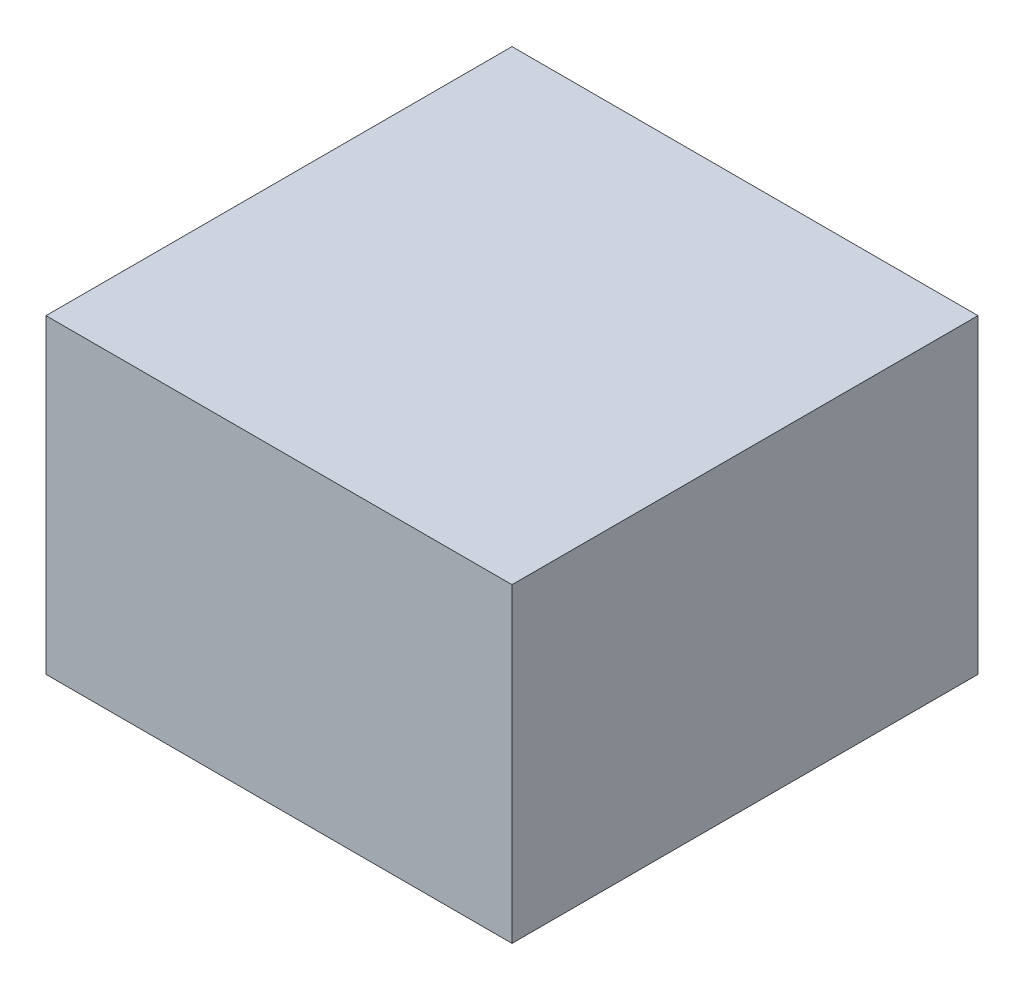
ISO-10303-21;
HEADER;
FILE_DESCRIPTION(('STEP AP214'),'2;1');
FILE_NAME('part.step','',(''),(''),'','','');
FILE_SCHEMA(('AUTOMOTIVE_DESIGN { 1 0 10303 214 1 1 1 1 }'));
ENDSEC;
DATA;
#1=APPLICATION_CONTEXT('core data for automotive mechanical design processes');
#2=APPLICATION_PROTOCOL_DEFINITION('international standard','automotive_design',2000,#1);
#3=PRODUCT_CONTEXT('',#1,'mechanical');
#4=PRODUCT('Part','Part','',(#3));
#5=PRODUCT_RELATED_PRODUCT_CATEGORY('part','',(#4));
#6=PRODUCT_DEFINITION_FORMATION('','',#4);
#7=PRODUCT_DEFINITION_CONTEXT('part definition',#1,'design');
#8=PRODUCT_DEFINITION('design','',#6,#7);
#9=PRODUCT_DEFINITION_SHAPE('','',#8);
#10=(LENGTH_UNIT() NAMED_UNIT(*) SI_UNIT(.MILLI.,.METRE.));
#11=(NAMED_UNIT(*) PLANE_ANGLE_UNIT() SI_UNIT($,.RADIAN.));
#12=(NAMED_UNIT(*) SI_UNIT($,.STERADIAN.) SOLID_ANGLE_UNIT());
#13=UNCERTAINTY_MEASURE_WITH_UNIT(LENGTH_MEASURE(1.E-05),#10,'distance_accuracy_value','');
#14=(GEOMETRIC_REPRESENTATION_CONTEXT(3) GLOBAL_UNCERTAINTY_ASSIGNED_CONTEXT((#13)) GLOBAL_UNIT_ASSIGNED_CONTEXT((#10,
#11,#12)) REPRESENTATION_CONTEXT('',''));
#15=CARTESIAN_POINT('',(0.,0.,0.));
#16=DIRECTION('',(0.,0.,1.));
#17=DIRECTION('',(1.,0.,0.));
#18=AXIS2_PLACEMENT_3D('',#15,#16,#17);
#19=CARTESIAN_POINT('',(0.,100.,0.));
#20=DIRECTION('',(1.,0.,0.));
#21=DIRECTION('',(0.,0.,-1.));
#22=AXIS2_PLACEMENT_3D('',#19,#20,#21);
#23=PLANE('',#22);
#24=DIRECTION('',(0.,0.,1.));
#25=VECTOR('',#24,1.);
#26=CARTESIAN_POINT('',(0.,0.,0.));
#27=LINE('',#26,#25);
#28=CARTESIAN_POINT('',(0.,0.,0.));
#29=VERTEX_POINT('',#28);
#30=CARTESIAN_POINT('',(0.,0.,150.));
#31=VERTEX_POINT('',#30);
#32=EDGE_CURVE('E98',#29,#31,#27,.T.);
#33=ORIENTED_EDGE('',*,*,#32,.T.);
#34=DIRECTION('',(0.,-1.,0.));
#35=VECTOR('',#34,1.);
#36=CARTESIAN_POINT('',(0.,100.,150.));
#37=LINE('',#36,#35);
#38=CARTESIAN_POINT('',(0.,100.,150.));
#39=VERTEX_POINT('',#38);
#40=EDGE_CURVE('E11',#39,#31,#37,.T.);
#41=ORIENTED_EDGE('',*,*,#40,.F.);
#42=DIRECTION('',(0.,0.,1.));
#43=VECTOR('',#42,1.);
#44=CARTESIAN_POINT('',(0.,100.,0.));
#45=LINE('',#44,#43);
#46=CARTESIAN_POINT('',(0.,100.,0.));
#47=VERTEX_POINT('',#46);
#48=EDGE_CURVE('E86',#47,#39,#45,.T.);
#49=ORIENTED_EDGE('',*,*,#48,.F.);
#50=DIRECTION('',(0.,-1.,0.));
#51=VECTOR('',#50,1.);
#52=CARTESIAN_POINT('',(0.,100.,0.));
#53=LINE('',#52,#51);
#54=EDGE_CURVE('E94',#47,#29,#53,.T.);
#55=ORIENTED_EDGE('',*,*,#54,.T.);
#56=EDGE_LOOP('',(#33,#41,#49,#55));
#57=FACE_BOUND('',#56,.T.);
#58=ADVANCED_FACE('F35',(#57),#23,.F.);
#59=CARTESIAN_POINT('',(0.,100.,150.));
#60=DIRECTION('',(0.,0.,-1.));
#61=DIRECTION('',(-1.,0.,0.));
#62=AXIS2_PLACEMENT_3D('',#59,#60,#61);
#63=PLANE('',#62);
#64=DIRECTION('',(1.,0.,0.));
#65=VECTOR('',#64,1.);
#66=CARTESIAN_POINT('',(0.,0.,150.));
#67=LINE('',#66,#65);
#68=CARTESIAN_POINT('',(150.,0.,150.));
#69=VERTEX_POINT('',#68);
#70=EDGE_CURVE('E90',#31,#69,#67,.T.);
#71=ORIENTED_EDGE('',*,*,#70,.T.);
#72=DIRECTION('',(0.,-1.,0.));
#73=VECTOR('',#72,1.);
#74=CARTESIAN_POINT('',(150.,100.,150.));
#75=LINE('',#74,#73);
#76=CARTESIAN_POINT('',(150.,100.,150.));
#77=VERTEX_POINT('',#76);
#78=EDGE_CURVE('E43',#77,#69,#75,.T.);
#79=ORIENTED_EDGE('',*,*,#78,.F.);
#80=DIRECTION('',(1.,0.,0.));
#81=VECTOR('',#80,1.);
#82=CARTESIAN_POINT('',(0.,100.,150.));
#83=LINE('',#82,#81);
#84=EDGE_CURVE('E81',#39,#77,#83,.T.);
#85=ORIENTED_EDGE('',*,*,#84,.F.);
#86=ORIENTED_EDGE('',*,*,#40,.T.);
#87=EDGE_LOOP('',(#71,#79,#85,#86));
#88=FACE_BOUND('',#87,.T.);
#89=ADVANCED_FACE('F89',(#88),#63,.F.);
#90=CARTESIAN_POINT('',(150.,100.,0.));
#91=DIRECTION('',(-1.,0.,0.));
#92=DIRECTION('',(0.,0.,1.));
#93=AXIS2_PLACEMENT_3D('',#90,#91,#92);
#94=PLANE('',#93);
#95=DIRECTION('',(0.,0.,-1.));
#96=VECTOR('',#95,1.);
#97=CARTESIAN_POINT('',(150.,0.,0.));
#98=LINE('',#97,#96);
#99=CARTESIAN_POINT('',(150.,0.,0.));
#100=VERTEX_POINT('',#99);
#101=EDGE_CURVE('E68',#69,#100,#98,.T.);
#102=ORIENTED_EDGE('',*,*,#101,.T.);
#103=DIRECTION('',(0.,-1.,0.));
#104=VECTOR('',#103,1.);
#105=CARTESIAN_POINT('',(150.,100.,0.));
#106=LINE('',#105,#104);
#107=CARTESIAN_POINT('',(150.,100.,0.));
#108=VERTEX_POINT('',#107);
#109=EDGE_CURVE('E91',#108,#100,#106,.T.);
#110=ORIENTED_EDGE('',*,*,#109,.F.);
#111=DIRECTION('',(0.,0.,-1.));
#112=VECTOR('',#111,1.);
#113=CARTESIAN_POINT('',(150.,100.,0.));
#114=LINE('',#113,#112);
#115=EDGE_CURVE('E84',#77,#108,#114,.T.);
#116=ORIENTED_EDGE('',*,*,#115,.F.);
#117=ORIENTED_EDGE('',*,*,#78,.T.);
#118=EDGE_LOOP('',(#102,#110,#116,#117));
#119=FACE_BOUND('',#118,.T.);
#120=ADVANCED_FACE('F92',(#119),#94,.F.);
#121=CARTESIAN_POINT('',(0.,100.,0.));
#122=DIRECTION('',(0.,0.,1.));
#123=DIRECTION('',(1.,0.,0.));
#124=AXIS2_PLACEMENT_3D('',#121,#122,#123);
#125=PLANE('',#124);
#126=DIRECTION('',(-1.,0.,0.));
#127=VECTOR('',#126,1.);
#128=CARTESIAN_POINT('',(0.,0.,0.));
#129=LINE('',#128,#127);
#130=EDGE_CURVE('E74',#100,#29,#129,.T.);
#131=ORIENTED_EDGE('',*,*,#130,.T.);
#132=ORIENTED_EDGE('',*,*,#54,.F.);
#133=DIRECTION('',(-1.,0.,0.));
#134=VECTOR('',#133,1.);
#135=CARTESIAN_POINT('',(0.,100.,0.));
#136=LINE('',#135,#134);
#137=EDGE_CURVE('E51',#108,#47,#136,.T.);
#138=ORIENTED_EDGE('',*,*,#137,.F.);
#139=ORIENTED_EDGE('',*,*,#109,.T.);
#140=EDGE_LOOP('',(#131,#132,#138,#139));
#141=FACE_BOUND('',#140,.T.);
#142=ADVANCED_FACE('F105',(#141),#125,.F.);
#143=CARTESIAN_POINT('',(0.,100.,0.));
#144=DIRECTION('',(0.,1.,0.));
#145=DIRECTION('',(0.,0.,1.));
#146=AXIS2_PLACEMENT_3D('',#143,#144,#145);
#147=PLANE('',#146);
#148=ORIENTED_EDGE('',*,*,#48,.T.);
#149=ORIENTED_EDGE('',*,*,#84,.T.);
#150=ORIENTED_EDGE('',*,*,#115,.T.);
#151=ORIENTED_EDGE('',*,*,#137,.T.);
#152=EDGE_LOOP('',(#148,#149,#150,#151));
#153=FACE_BOUND('',#152,.T.);
#154=ADVANCED_FACE('F82',(#153),#147,.T.);
#155=CARTESIAN_POINT('',(0.,0.,0.));
#156=DIRECTION('',(0.,1.,0.));
#157=DIRECTION('',(0.,0.,1.));
#158=AXIS2_PLACEMENT_3D('',#155,#156,#157);
#159=PLANE('',#158);
#160=ORIENTED_EDGE('',*,*,#32,.F.);
#161=ORIENTED_EDGE('',*,*,#130,.F.);
#162=ORIENTED_EDGE('',*,*,#101,.F.);
#163=ORIENTED_EDGE('',*,*,#70,.F.);
#164=EDGE_LOOP('',(#160,#161,#162,#163));
#165=FACE_BOUND('',#164,.T.);
#166=ADVANCED_FACE('F108',(#165),#159,.F.);
#167=CLOSED_SHELL('',(#58,#89,#120,#142,#154,#166));
#168=MANIFOLD_SOLID_BREP('B2',#167);
#169=ADVANCED_BREP_SHAPE_REPRESENTATION('',(#18,#168),#14);
#170=SHAPE_DEFINITION_REPRESENTATION(#9,#169);
ENDSEC;
END-ISO-10303-21;
